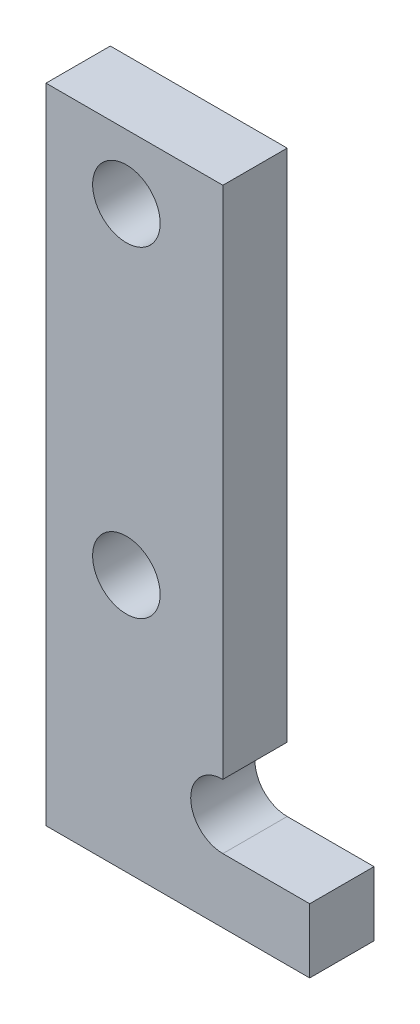
ISO-10303-21;
HEADER;
FILE_DESCRIPTION(('STEP AP214'),'2;1');
FILE_NAME('part.step','',(''),(''),'','','');
FILE_SCHEMA(('AUTOMOTIVE_DESIGN { 1 0 10303 214 1 1 1 1 }'));
ENDSEC;
DATA;
#1=APPLICATION_CONTEXT('core data for automotive mechanical design processes');
#2=APPLICATION_PROTOCOL_DEFINITION('international standard','automotive_design',2000,#1);
#3=PRODUCT_CONTEXT('',#1,'mechanical');
#4=PRODUCT('Part','Part','',(#3));
#5=PRODUCT_RELATED_PRODUCT_CATEGORY('part','',(#4));
#6=PRODUCT_DEFINITION_FORMATION('','',#4);
#7=PRODUCT_DEFINITION_CONTEXT('part definition',#1,'design');
#8=PRODUCT_DEFINITION('design','',#6,#7);
#9=PRODUCT_DEFINITION_SHAPE('','',#8);
#10=(LENGTH_UNIT() NAMED_UNIT(*) SI_UNIT(.MILLI.,.METRE.));
#11=(NAMED_UNIT(*) PLANE_ANGLE_UNIT() SI_UNIT($,.RADIAN.));
#12=(NAMED_UNIT(*) SI_UNIT($,.STERADIAN.) SOLID_ANGLE_UNIT());
#13=UNCERTAINTY_MEASURE_WITH_UNIT(LENGTH_MEASURE(1.E-05),#10,'distance_accuracy_value','');
#14=(GEOMETRIC_REPRESENTATION_CONTEXT(3) GLOBAL_UNCERTAINTY_ASSIGNED_CONTEXT((#13)) GLOBAL_UNIT_ASSIGNED_CONTEXT((#10,
#11,#12)) REPRESENTATION_CONTEXT('',''));
#15=CARTESIAN_POINT('',(0.,0.,0.));
#16=DIRECTION('',(0.,0.,1.));
#17=DIRECTION('',(1.,0.,0.));
#18=AXIS2_PLACEMENT_3D('',#15,#16,#17);
#19=CARTESIAN_POINT('',(2.5,-10.,2.));
#20=DIRECTION('',(-1.,0.,0.));
#21=DIRECTION('',(0.,0.,1.));
#22=AXIS2_PLACEMENT_3D('',#19,#20,#21);
#23=PLANE('',#22);
#24=DIRECTION('',(0.,1.,0.));
#25=VECTOR('',#24,1.);
#26=CARTESIAN_POINT('',(2.5,-10.,2.));
#27=LINE('',#26,#25);
#28=CARTESIAN_POINT('',(2.5,-6.,2.));
#29=VERTEX_POINT('',#28);
#30=CARTESIAN_POINT('',(2.5,10.,2.));
#31=VERTEX_POINT('',#30);
#32=EDGE_CURVE('E53',#29,#31,#27,.T.);
#33=ORIENTED_EDGE('',*,*,#32,.F.);
#34=DIRECTION('',(0.,0.,1.));
#35=VECTOR('',#34,1.);
#36=CARTESIAN_POINT('',(2.5,-6.,-10.));
#37=LINE('',#36,#35);
#38=CARTESIAN_POINT('',(2.5,-6.,0.));
#39=VERTEX_POINT('',#38);
#40=EDGE_CURVE('E179',#29,#39,#37,.F.);
#41=ORIENTED_EDGE('',*,*,#40,.T.);
#42=DIRECTION('',(0.,1.,0.));
#43=VECTOR('',#42,1.);
#44=CARTESIAN_POINT('',(2.5,-10.,0.));
#45=LINE('',#44,#43);
#46=CARTESIAN_POINT('',(2.5,10.,0.));
#47=VERTEX_POINT('',#46);
#48=EDGE_CURVE('E104',#39,#47,#45,.T.);
#49=ORIENTED_EDGE('',*,*,#48,.T.);
#50=DIRECTION('',(0.,0.,-1.));
#51=VECTOR('',#50,1.);
#52=CARTESIAN_POINT('',(2.5,10.,2.));
#53=LINE('',#52,#51);
#54=EDGE_CURVE('E12',#31,#47,#53,.T.);
#55=ORIENTED_EDGE('',*,*,#54,.F.);
#56=EDGE_LOOP('',(#33,#41,#49,#55));
#57=FACE_BOUND('',#56,.T.);
#58=ADVANCED_FACE('F39',(#57),#23,.F.);
#59=CARTESIAN_POINT('',(-2.5,10.,2.));
#60=DIRECTION('',(0.,-1.,0.));
#61=DIRECTION('',(0.,0.,-1.));
#62=AXIS2_PLACEMENT_3D('',#59,#60,#61);
#63=PLANE('',#62);
#64=DIRECTION('',(-1.,0.,0.));
#65=VECTOR('',#64,1.);
#66=CARTESIAN_POINT('',(-2.5,10.,0.));
#67=LINE('',#66,#65);
#68=CARTESIAN_POINT('',(-3.,10.,0.));
#69=VERTEX_POINT('',#68);
#70=EDGE_CURVE('E94',#47,#69,#67,.T.);
#71=ORIENTED_EDGE('',*,*,#70,.T.);
#72=DIRECTION('',(0.,0.,1.));
#73=VECTOR('',#72,1.);
#74=CARTESIAN_POINT('',(-3.,10.,0.));
#75=LINE('',#74,#73);
#76=CARTESIAN_POINT('',(-3.,10.,2.));
#77=VERTEX_POINT('',#76);
#78=EDGE_CURVE('E97',#69,#77,#75,.T.);
#79=ORIENTED_EDGE('',*,*,#78,.T.);
#80=DIRECTION('',(-1.,0.,0.));
#81=VECTOR('',#80,1.);
#82=CARTESIAN_POINT('',(-2.5,10.,2.));
#83=LINE('',#82,#81);
#84=EDGE_CURVE('E136',#31,#77,#83,.T.);
#85=ORIENTED_EDGE('',*,*,#84,.F.);
#86=ORIENTED_EDGE('',*,*,#54,.T.);
#87=EDGE_LOOP('',(#71,#79,#85,#86));
#88=FACE_BOUND('',#87,.T.);
#89=ADVANCED_FACE('F96',(#88),#63,.F.);
#90=CARTESIAN_POINT('',(-2.5,-10.,2.));
#91=DIRECTION('',(0.,1.,0.));
#92=DIRECTION('',(0.,0.,1.));
#93=AXIS2_PLACEMENT_3D('',#90,#91,#92);
#94=PLANE('',#93);
#95=DIRECTION('',(1.,0.,0.));
#96=VECTOR('',#95,1.);
#97=CARTESIAN_POINT('',(-2.5,-10.,0.));
#98=LINE('',#97,#96);
#99=CARTESIAN_POINT('',(-3.,-10.,0.));
#100=VERTEX_POINT('',#99);
#101=CARTESIAN_POINT('',(5.2,-10.,0.));
#102=VERTEX_POINT('',#101);
#103=EDGE_CURVE('E103',#100,#102,#98,.T.);
#104=ORIENTED_EDGE('',*,*,#103,.T.);
#105=DIRECTION('',(0.,0.,1.));
#106=VECTOR('',#105,1.);
#107=CARTESIAN_POINT('',(5.2,-10.,-3.36005952328229));
#108=LINE('',#107,#106);
#109=CARTESIAN_POINT('',(5.2,-10.,2.));
#110=VERTEX_POINT('',#109);
#111=EDGE_CURVE('E140',#102,#110,#108,.T.);
#112=ORIENTED_EDGE('',*,*,#111,.T.);
#113=DIRECTION('',(1.,0.,0.));
#114=VECTOR('',#113,1.);
#115=CARTESIAN_POINT('',(-2.5,-10.,2.));
#116=LINE('',#115,#114);
#117=CARTESIAN_POINT('',(-3.,-10.,2.));
#118=VERTEX_POINT('',#117);
#119=EDGE_CURVE('E47',#118,#110,#116,.T.);
#120=ORIENTED_EDGE('',*,*,#119,.F.);
#121=DIRECTION('',(0.,0.,1.));
#122=VECTOR('',#121,1.);
#123=CARTESIAN_POINT('',(-3.,-10.,0.));
#124=LINE('',#123,#122);
#125=EDGE_CURVE('E113',#100,#118,#124,.T.);
#126=ORIENTED_EDGE('',*,*,#125,.F.);
#127=EDGE_LOOP('',(#104,#112,#120,#126));
#128=FACE_BOUND('',#127,.T.);
#129=ADVANCED_FACE('F149',(#128),#94,.F.);
#130=CARTESIAN_POINT('',(0.,0.,2.));
#131=DIRECTION('',(0.,0.,-1.));
#132=DIRECTION('',(-1.,0.,0.));
#133=AXIS2_PLACEMENT_3D('',#130,#131,#132);
#134=PLANE('',#133);
#135=CARTESIAN_POINT('',(-0.5,-2.,2.));
#136=DIRECTION('',(0.,0.,1.));
#137=DIRECTION('',(1.,0.,0.));
#138=AXIS2_PLACEMENT_3D('',#135,#136,#137);
#139=CIRCLE('',#138,1.05);
#140=CARTESIAN_POINT('',(0.550000000000001,-2.,2.));
#141=VERTEX_POINT('',#140);
#142=EDGE_CURVE('E161',#141,#141,#139,.T.);
#143=ORIENTED_EDGE('',*,*,#142,.F.);
#144=EDGE_LOOP('',(#143));
#145=FACE_BOUND('',#144,.T.);
#146=CARTESIAN_POINT('',(-0.5,8.,2.));
#147=DIRECTION('',(0.,0.,1.));
#148=DIRECTION('',(1.,0.,0.));
#149=AXIS2_PLACEMENT_3D('',#146,#147,#148);
#150=CIRCLE('',#149,1.05);
#151=CARTESIAN_POINT('',(0.55,8.,2.));
#152=VERTEX_POINT('',#151);
#153=EDGE_CURVE('E182',#152,#152,#150,.T.);
#154=ORIENTED_EDGE('',*,*,#153,.F.);
#155=EDGE_LOOP('',(#154));
#156=FACE_BOUND('',#155,.T.);
#157=DIRECTION('',(-1.,0.,0.));
#158=VECTOR('',#157,1.);
#159=CARTESIAN_POINT('',(2.5,-8.,2.));
#160=LINE('',#159,#158);
#161=CARTESIAN_POINT('',(5.2,-8.,2.));
#162=VERTEX_POINT('',#161);
#163=CARTESIAN_POINT('',(2.5,-8.,2.));
#164=VERTEX_POINT('',#163);
#165=EDGE_CURVE('E153',#162,#164,#160,.T.);
#166=ORIENTED_EDGE('',*,*,#165,.T.);
#167=CARTESIAN_POINT('',(2.5,-7.,2.));
#168=DIRECTION('',(0.,0.,1.));
#169=DIRECTION('',(1.,0.,0.));
#170=AXIS2_PLACEMENT_3D('',#167,#168,#169);
#171=CIRCLE('',#170,1.);
#172=EDGE_CURVE('E180',#29,#164,#171,.T.);
#173=ORIENTED_EDGE('',*,*,#172,.F.);
#174=ORIENTED_EDGE('',*,*,#32,.T.);
#175=ORIENTED_EDGE('',*,*,#84,.T.);
#176=DIRECTION('',(0.,-1.,0.));
#177=VECTOR('',#176,1.);
#178=CARTESIAN_POINT('',(-3.,10.,2.));
#179=LINE('',#178,#177);
#180=EDGE_CURVE('E112',#77,#118,#179,.T.);
#181=ORIENTED_EDGE('',*,*,#180,.T.);
#182=ORIENTED_EDGE('',*,*,#119,.T.);
#183=DIRECTION('',(0.,1.,0.));
#184=VECTOR('',#183,1.);
#185=CARTESIAN_POINT('',(5.2,-8.,2.));
#186=LINE('',#185,#184);
#187=EDGE_CURVE('E146',#110,#162,#186,.T.);
#188=ORIENTED_EDGE('',*,*,#187,.T.);
#189=EDGE_LOOP('',(#166,#173,#174,#175,#181,#182,#188));
#190=FACE_BOUND('',#189,.T.);
#191=ADVANCED_FACE('F144',(#145,#156,#190),#134,.F.);
#192=CARTESIAN_POINT('',(0.,0.,0.));
#193=DIRECTION('',(0.,0.,-1.));
#194=DIRECTION('',(-1.,0.,0.));
#195=AXIS2_PLACEMENT_3D('',#192,#193,#194);
#196=PLANE('',#195);
#197=CARTESIAN_POINT('',(2.5,-7.,0.));
#198=DIRECTION('',(0.,0.,-1.));
#199=DIRECTION('',(-1.,0.,0.));
#200=AXIS2_PLACEMENT_3D('',#197,#198,#199);
#201=CIRCLE('',#200,1.);
#202=CARTESIAN_POINT('',(2.5,-8.,0.));
#203=VERTEX_POINT('',#202);
#204=EDGE_CURVE('E175',#203,#39,#201,.T.);
#205=ORIENTED_EDGE('',*,*,#204,.F.);
#206=DIRECTION('',(-1.,0.,0.));
#207=VECTOR('',#206,1.);
#208=CARTESIAN_POINT('',(2.5,-8.,0.));
#209=LINE('',#208,#207);
#210=CARTESIAN_POINT('',(5.2,-8.,0.));
#211=VERTEX_POINT('',#210);
#212=EDGE_CURVE('E165',#211,#203,#209,.T.);
#213=ORIENTED_EDGE('',*,*,#212,.F.);
#214=DIRECTION('',(0.,1.,0.));
#215=VECTOR('',#214,1.);
#216=CARTESIAN_POINT('',(5.2,-8.,0.));
#217=LINE('',#216,#215);
#218=EDGE_CURVE('E152',#102,#211,#217,.T.);
#219=ORIENTED_EDGE('',*,*,#218,.F.);
#220=ORIENTED_EDGE('',*,*,#103,.F.);
#221=DIRECTION('',(0.,-1.,0.));
#222=VECTOR('',#221,1.);
#223=CARTESIAN_POINT('',(-3.,10.,0.));
#224=LINE('',#223,#222);
#225=EDGE_CURVE('E110',#69,#100,#224,.T.);
#226=ORIENTED_EDGE('',*,*,#225,.F.);
#227=ORIENTED_EDGE('',*,*,#70,.F.);
#228=ORIENTED_EDGE('',*,*,#48,.F.);
#229=EDGE_LOOP('',(#205,#213,#219,#220,#226,#227,#228));
#230=FACE_BOUND('',#229,.T.);
#231=CARTESIAN_POINT('',(-0.5,-2.,0.));
#232=DIRECTION('',(0.,0.,1.));
#233=DIRECTION('',(1.,0.,0.));
#234=AXIS2_PLACEMENT_3D('',#231,#232,#233);
#235=CIRCLE('',#234,1.05);
#236=CARTESIAN_POINT('',(0.550000000000001,-2.,0.));
#237=VERTEX_POINT('',#236);
#238=EDGE_CURVE('E157',#237,#237,#235,.T.);
#239=ORIENTED_EDGE('',*,*,#238,.T.);
#240=EDGE_LOOP('',(#239));
#241=FACE_BOUND('',#240,.T.);
#242=CARTESIAN_POINT('',(-0.5,8.,0.));
#243=DIRECTION('',(0.,0.,1.));
#244=DIRECTION('',(1.,0.,0.));
#245=AXIS2_PLACEMENT_3D('',#242,#243,#244);
#246=CIRCLE('',#245,1.05);
#247=CARTESIAN_POINT('',(0.55,8.,0.));
#248=VERTEX_POINT('',#247);
#249=EDGE_CURVE('E186',#248,#248,#246,.T.);
#250=ORIENTED_EDGE('',*,*,#249,.T.);
#251=EDGE_LOOP('',(#250));
#252=FACE_BOUND('',#251,.T.);
#253=ADVANCED_FACE('F116',(#230,#241,#252),#196,.T.);
#254=CARTESIAN_POINT('',(5.2,-8.,-3.36005952328229));
#255=DIRECTION('',(1.,0.,0.));
#256=DIRECTION('',(0.,1.,0.));
#257=AXIS2_PLACEMENT_3D('',#254,#255,#256);
#258=PLANE('',#257);
#259=ORIENTED_EDGE('',*,*,#111,.F.);
#260=ORIENTED_EDGE('',*,*,#218,.T.);
#261=DIRECTION('',(0.,0.,1.));
#262=VECTOR('',#261,1.);
#263=CARTESIAN_POINT('',(5.2,-8.,-3.36005952328229));
#264=LINE('',#263,#262);
#265=EDGE_CURVE('E156',#211,#162,#264,.T.);
#266=ORIENTED_EDGE('',*,*,#265,.T.);
#267=ORIENTED_EDGE('',*,*,#187,.F.);
#268=EDGE_LOOP('',(#259,#260,#266,#267));
#269=FACE_BOUND('',#268,.T.);
#270=ADVANCED_FACE('F154',(#269),#258,.T.);
#271=CARTESIAN_POINT('',(2.5,-8.,-3.36005952328229));
#272=DIRECTION('',(0.,1.,0.));
#273=DIRECTION('',(0.,0.,1.));
#274=AXIS2_PLACEMENT_3D('',#271,#272,#273);
#275=PLANE('',#274);
#276=ORIENTED_EDGE('',*,*,#265,.F.);
#277=ORIENTED_EDGE('',*,*,#212,.T.);
#278=DIRECTION('',(0.,0.,1.));
#279=VECTOR('',#278,1.);
#280=CARTESIAN_POINT('',(2.5,-8.,-3.36005952328229));
#281=LINE('',#280,#279);
#282=EDGE_CURVE('E169',#203,#164,#281,.T.);
#283=ORIENTED_EDGE('',*,*,#282,.T.);
#284=ORIENTED_EDGE('',*,*,#165,.F.);
#285=EDGE_LOOP('',(#276,#277,#283,#284));
#286=FACE_BOUND('',#285,.T.);
#287=ADVANCED_FACE('F212',(#286),#275,.T.);
#288=CARTESIAN_POINT('',(-0.5,8.,0.));
#289=DIRECTION('',(0.,0.,1.));
#290=DIRECTION('',(1.,0.,0.));
#291=AXIS2_PLACEMENT_3D('',#288,#289,#290);
#292=CYLINDRICAL_SURFACE('',#291,1.05);
#293=ORIENTED_EDGE('',*,*,#249,.F.);
#294=EDGE_LOOP('',(#293));
#295=FACE_BOUND('',#294,.T.);
#296=ORIENTED_EDGE('',*,*,#153,.T.);
#297=EDGE_LOOP('',(#296));
#298=FACE_BOUND('',#297,.T.);
#299=ADVANCED_FACE('F192',(#295,#298),#292,.F.);
#300=CARTESIAN_POINT('',(-0.5,-2.,0.));
#301=DIRECTION('',(0.,0.,1.));
#302=DIRECTION('',(1.,0.,0.));
#303=AXIS2_PLACEMENT_3D('',#300,#301,#302);
#304=CYLINDRICAL_SURFACE('',#303,1.05);
#305=ORIENTED_EDGE('',*,*,#238,.F.);
#306=EDGE_LOOP('',(#305));
#307=FACE_BOUND('',#306,.T.);
#308=ORIENTED_EDGE('',*,*,#142,.T.);
#309=EDGE_LOOP('',(#308));
#310=FACE_BOUND('',#309,.T.);
#311=ADVANCED_FACE('F216',(#307,#310),#304,.F.);
#312=CARTESIAN_POINT('',(2.5,-7.,-10.));
#313=DIRECTION('',(0.,0.,1.));
#314=DIRECTION('',(1.,0.,0.));
#315=AXIS2_PLACEMENT_3D('',#312,#313,#314);
#316=CYLINDRICAL_SURFACE('',#315,1.);
#317=ORIENTED_EDGE('',*,*,#172,.T.);
#318=ORIENTED_EDGE('',*,*,#282,.F.);
#319=ORIENTED_EDGE('',*,*,#204,.T.);
#320=ORIENTED_EDGE('',*,*,#40,.F.);
#321=EDGE_LOOP('',(#317,#318,#319,#320));
#322=FACE_BOUND('',#321,.T.);
#323=ADVANCED_FACE('F214',(#322),#316,.F.);
#324=CARTESIAN_POINT('',(-3.,10.,0.));
#325=DIRECTION('',(-1.,0.,0.));
#326=DIRECTION('',(0.,-1.,0.));
#327=AXIS2_PLACEMENT_3D('',#324,#325,#326);
#328=PLANE('',#327);
#329=ORIENTED_EDGE('',*,*,#180,.F.);
#330=ORIENTED_EDGE('',*,*,#78,.F.);
#331=ORIENTED_EDGE('',*,*,#225,.T.);
#332=ORIENTED_EDGE('',*,*,#125,.T.);
#333=EDGE_LOOP('',(#329,#330,#331,#332));
#334=FACE_BOUND('',#333,.T.);
#335=ADVANCED_FACE('F108',(#334),#328,.T.);
#336=CLOSED_SHELL('',(#58,#89,#129,#191,#253,#270,#287,#299,#311,#323,#335));
#337=MANIFOLD_SOLID_BREP('B2',#336);
#338=ADVANCED_BREP_SHAPE_REPRESENTATION('',(#18,#337),#14);
#339=SHAPE_DEFINITION_REPRESENTATION(#9,#338);
ENDSEC;
END-ISO-10303-21;
